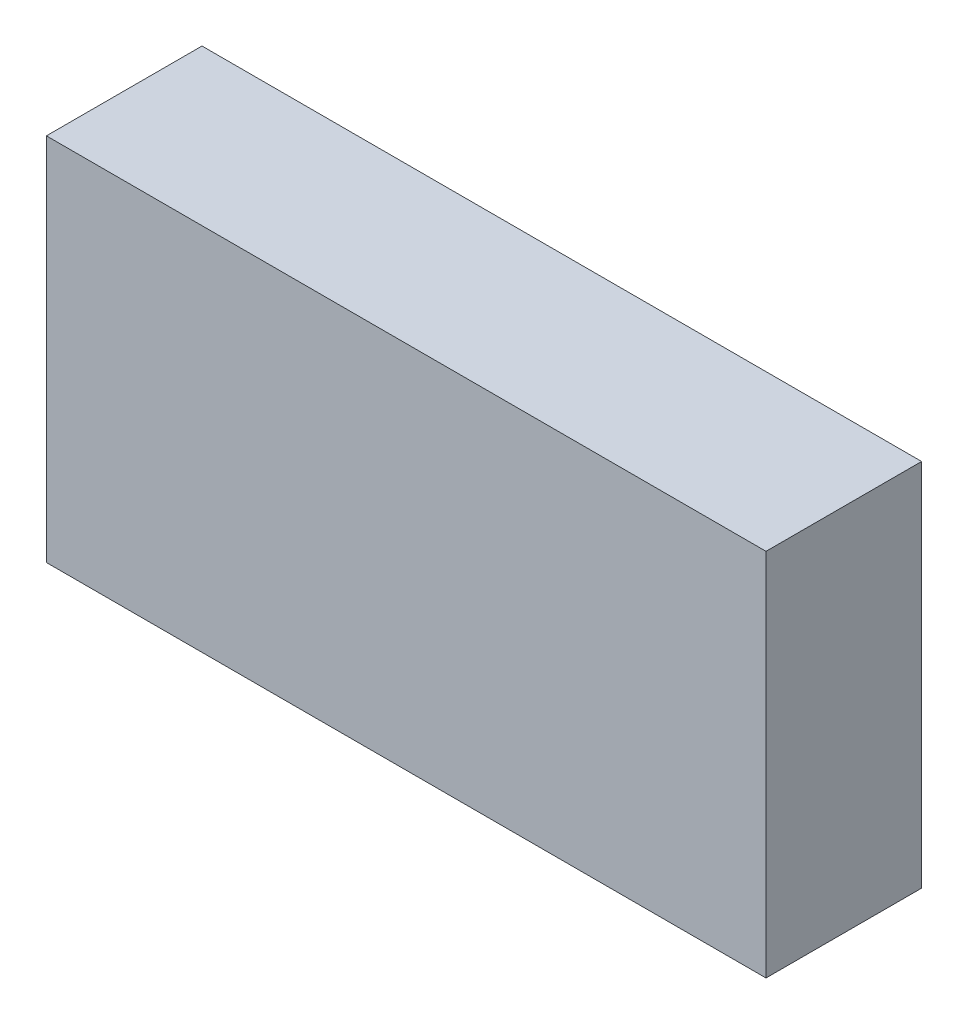
ISO-10303-21;
HEADER;
FILE_DESCRIPTION(('STEP AP214'),'2;1');
FILE_NAME('part.step','',(''),(''),'','','');
FILE_SCHEMA(('AUTOMOTIVE_DESIGN { 1 0 10303 214 1 1 1 1 }'));
ENDSEC;
DATA;
#1=APPLICATION_CONTEXT('core data for automotive mechanical design processes');
#2=APPLICATION_PROTOCOL_DEFINITION('international standard','automotive_design',2000,#1);
#3=PRODUCT_CONTEXT('',#1,'mechanical');
#4=PRODUCT('Part','Part','',(#3));
#5=PRODUCT_RELATED_PRODUCT_CATEGORY('part','',(#4));
#6=PRODUCT_DEFINITION_FORMATION('','',#4);
#7=PRODUCT_DEFINITION_CONTEXT('part definition',#1,'design');
#8=PRODUCT_DEFINITION('design','',#6,#7);
#9=PRODUCT_DEFINITION_SHAPE('','',#8);
#10=(LENGTH_UNIT() NAMED_UNIT(*) SI_UNIT(.MILLI.,.METRE.));
#11=(NAMED_UNIT(*) PLANE_ANGLE_UNIT() SI_UNIT($,.RADIAN.));
#12=(NAMED_UNIT(*) SI_UNIT($,.STERADIAN.) SOLID_ANGLE_UNIT());
#13=UNCERTAINTY_MEASURE_WITH_UNIT(LENGTH_MEASURE(1.E-05),#10,'distance_accuracy_value','');
#14=(GEOMETRIC_REPRESENTATION_CONTEXT(3) GLOBAL_UNCERTAINTY_ASSIGNED_CONTEXT((#13)) GLOBAL_UNIT_ASSIGNED_CONTEXT((#10,
#11,#12)) REPRESENTATION_CONTEXT('',''));
#15=CARTESIAN_POINT('',(0.,0.,0.));
#16=DIRECTION('',(0.,0.,1.));
#17=DIRECTION('',(1.,0.,0.));
#18=AXIS2_PLACEMENT_3D('',#15,#16,#17);
#19=CARTESIAN_POINT('',(18.5,9.5,4.));
#20=DIRECTION('',(-1.,0.,0.));
#21=DIRECTION('',(0.,0.,1.));
#22=AXIS2_PLACEMENT_3D('',#19,#20,#21);
#23=PLANE('',#22);
#24=DIRECTION('',(0.,1.,0.));
#25=VECTOR('',#24,1.);
#26=CARTESIAN_POINT('',(18.5,9.5,-4.));
#27=LINE('',#26,#25);
#28=CARTESIAN_POINT('',(18.5,-9.5,-4.));
#29=VERTEX_POINT('',#28);
#30=CARTESIAN_POINT('',(18.5,9.5,-4.));
#31=VERTEX_POINT('',#30);
#32=EDGE_CURVE('E97',#29,#31,#27,.T.);
#33=ORIENTED_EDGE('',*,*,#32,.T.);
#34=DIRECTION('',(0.,0.,-1.));
#35=VECTOR('',#34,1.);
#36=CARTESIAN_POINT('',(18.5,9.5,4.));
#37=LINE('',#36,#35);
#38=CARTESIAN_POINT('',(18.5,9.5,4.));
#39=VERTEX_POINT('',#38);
#40=EDGE_CURVE('E11',#39,#31,#37,.T.);
#41=ORIENTED_EDGE('',*,*,#40,.F.);
#42=DIRECTION('',(0.,1.,0.));
#43=VECTOR('',#42,1.);
#44=CARTESIAN_POINT('',(18.5,9.5,4.));
#45=LINE('',#44,#43);
#46=CARTESIAN_POINT('',(18.5,-9.5,4.));
#47=VERTEX_POINT('',#46);
#48=EDGE_CURVE('E85',#47,#39,#45,.T.);
#49=ORIENTED_EDGE('',*,*,#48,.F.);
#50=DIRECTION('',(0.,0.,-1.));
#51=VECTOR('',#50,1.);
#52=CARTESIAN_POINT('',(18.5,-9.5,4.));
#53=LINE('',#52,#51);
#54=EDGE_CURVE('E93',#47,#29,#53,.T.);
#55=ORIENTED_EDGE('',*,*,#54,.T.);
#56=EDGE_LOOP('',(#33,#41,#49,#55));
#57=FACE_BOUND('',#56,.T.);
#58=ADVANCED_FACE('F34',(#57),#23,.F.);
#59=CARTESIAN_POINT('',(-18.5,9.5,4.));
#60=DIRECTION('',(0.,-1.,0.));
#61=DIRECTION('',(0.,0.,-1.));
#62=AXIS2_PLACEMENT_3D('',#59,#60,#61);
#63=PLANE('',#62);
#64=DIRECTION('',(-1.,0.,0.));
#65=VECTOR('',#64,1.);
#66=CARTESIAN_POINT('',(-18.5,9.5,-4.));
#67=LINE('',#66,#65);
#68=CARTESIAN_POINT('',(-18.5,9.5,-4.));
#69=VERTEX_POINT('',#68);
#70=EDGE_CURVE('E89',#31,#69,#67,.T.);
#71=ORIENTED_EDGE('',*,*,#70,.T.);
#72=DIRECTION('',(0.,0.,-1.));
#73=VECTOR('',#72,1.);
#74=CARTESIAN_POINT('',(-18.5,9.5,4.));
#75=LINE('',#74,#73);
#76=CARTESIAN_POINT('',(-18.5,9.5,4.));
#77=VERTEX_POINT('',#76);
#78=EDGE_CURVE('E42',#77,#69,#75,.T.);
#79=ORIENTED_EDGE('',*,*,#78,.F.);
#80=DIRECTION('',(-1.,0.,0.));
#81=VECTOR('',#80,1.);
#82=CARTESIAN_POINT('',(-18.5,9.5,4.));
#83=LINE('',#82,#81);
#84=EDGE_CURVE('E80',#39,#77,#83,.T.);
#85=ORIENTED_EDGE('',*,*,#84,.F.);
#86=ORIENTED_EDGE('',*,*,#40,.T.);
#87=EDGE_LOOP('',(#71,#79,#85,#86));
#88=FACE_BOUND('',#87,.T.);
#89=ADVANCED_FACE('F88',(#88),#63,.F.);
#90=CARTESIAN_POINT('',(-18.5,9.5,4.));
#91=DIRECTION('',(1.,0.,0.));
#92=DIRECTION('',(0.,0.,-1.));
#93=AXIS2_PLACEMENT_3D('',#90,#91,#92);
#94=PLANE('',#93);
#95=DIRECTION('',(0.,-1.,0.));
#96=VECTOR('',#95,1.);
#97=CARTESIAN_POINT('',(-18.5,9.5,-4.));
#98=LINE('',#97,#96);
#99=CARTESIAN_POINT('',(-18.5,-9.5,-4.));
#100=VERTEX_POINT('',#99);
#101=EDGE_CURVE('E67',#69,#100,#98,.T.);
#102=ORIENTED_EDGE('',*,*,#101,.T.);
#103=DIRECTION('',(0.,0.,-1.));
#104=VECTOR('',#103,1.);
#105=CARTESIAN_POINT('',(-18.5,-9.5,4.));
#106=LINE('',#105,#104);
#107=CARTESIAN_POINT('',(-18.5,-9.5,4.));
#108=VERTEX_POINT('',#107);
#109=EDGE_CURVE('E90',#108,#100,#106,.T.);
#110=ORIENTED_EDGE('',*,*,#109,.F.);
#111=DIRECTION('',(0.,-1.,0.));
#112=VECTOR('',#111,1.);
#113=CARTESIAN_POINT('',(-18.5,9.5,4.));
#114=LINE('',#113,#112);
#115=EDGE_CURVE('E83',#77,#108,#114,.T.);
#116=ORIENTED_EDGE('',*,*,#115,.F.);
#117=ORIENTED_EDGE('',*,*,#78,.T.);
#118=EDGE_LOOP('',(#102,#110,#116,#117));
#119=FACE_BOUND('',#118,.T.);
#120=ADVANCED_FACE('F91',(#119),#94,.F.);
#121=CARTESIAN_POINT('',(-18.5,-9.5,4.));
#122=DIRECTION('',(0.,1.,0.));
#123=DIRECTION('',(0.,0.,1.));
#124=AXIS2_PLACEMENT_3D('',#121,#122,#123);
#125=PLANE('',#124);
#126=DIRECTION('',(1.,0.,0.));
#127=VECTOR('',#126,1.);
#128=CARTESIAN_POINT('',(-18.5,-9.5,-4.));
#129=LINE('',#128,#127);
#130=EDGE_CURVE('E73',#100,#29,#129,.T.);
#131=ORIENTED_EDGE('',*,*,#130,.T.);
#132=ORIENTED_EDGE('',*,*,#54,.F.);
#133=DIRECTION('',(1.,0.,0.));
#134=VECTOR('',#133,1.);
#135=CARTESIAN_POINT('',(-18.5,-9.5,4.));
#136=LINE('',#135,#134);
#137=EDGE_CURVE('E50',#108,#47,#136,.T.);
#138=ORIENTED_EDGE('',*,*,#137,.F.);
#139=ORIENTED_EDGE('',*,*,#109,.T.);
#140=EDGE_LOOP('',(#131,#132,#138,#139));
#141=FACE_BOUND('',#140,.T.);
#142=ADVANCED_FACE('F104',(#141),#125,.F.);
#143=CARTESIAN_POINT('',(0.,0.,4.));
#144=DIRECTION('',(0.,0.,1.));
#145=DIRECTION('',(1.,0.,0.));
#146=AXIS2_PLACEMENT_3D('',#143,#144,#145);
#147=PLANE('',#146);
#148=ORIENTED_EDGE('',*,*,#48,.T.);
#149=ORIENTED_EDGE('',*,*,#84,.T.);
#150=ORIENTED_EDGE('',*,*,#115,.T.);
#151=ORIENTED_EDGE('',*,*,#137,.T.);
#152=EDGE_LOOP('',(#148,#149,#150,#151));
#153=FACE_BOUND('',#152,.T.);
#154=ADVANCED_FACE('F81',(#153),#147,.T.);
#155=CARTESIAN_POINT('',(0.,0.,-4.));
#156=DIRECTION('',(0.,0.,1.));
#157=DIRECTION('',(1.,0.,0.));
#158=AXIS2_PLACEMENT_3D('',#155,#156,#157);
#159=PLANE('',#158);
#160=ORIENTED_EDGE('',*,*,#32,.F.);
#161=ORIENTED_EDGE('',*,*,#130,.F.);
#162=ORIENTED_EDGE('',*,*,#101,.F.);
#163=ORIENTED_EDGE('',*,*,#70,.F.);
#164=EDGE_LOOP('',(#160,#161,#162,#163));
#165=FACE_BOUND('',#164,.T.);
#166=ADVANCED_FACE('F107',(#165),#159,.F.);
#167=CLOSED_SHELL('',(#58,#89,#120,#142,#154,#166));
#168=MANIFOLD_SOLID_BREP('B2',#167);
#169=ADVANCED_BREP_SHAPE_REPRESENTATION('',(#18,#168),#14);
#170=SHAPE_DEFINITION_REPRESENTATION(#9,#169);
ENDSEC;
END-ISO-10303-21;
